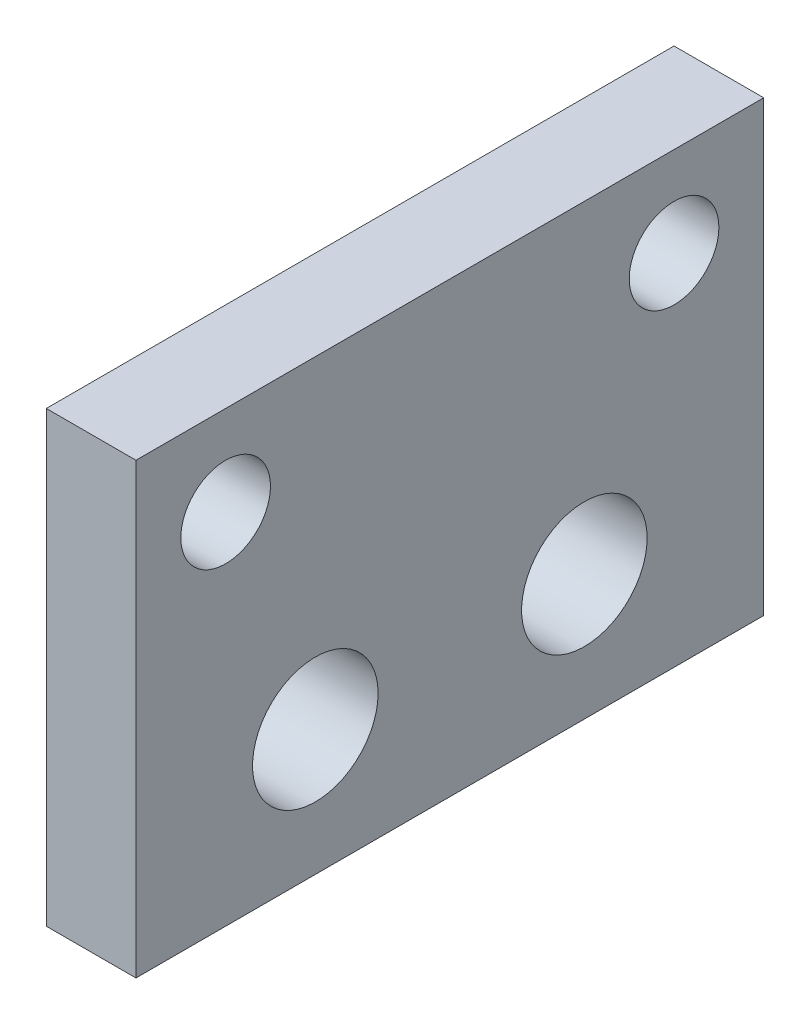
ISO-10303-21;
HEADER;
FILE_DESCRIPTION(('STEP AP214'),'2;1');
FILE_NAME('part.step','',(''),(''),'','','');
FILE_SCHEMA(('AUTOMOTIVE_DESIGN { 1 0 10303 214 1 1 1 1 }'));
ENDSEC;
DATA;
#1=APPLICATION_CONTEXT('core data for automotive mechanical design processes');
#2=APPLICATION_PROTOCOL_DEFINITION('international standard','automotive_design',2000,#1);
#3=PRODUCT_CONTEXT('',#1,'mechanical');
#4=PRODUCT('Part','Part','',(#3));
#5=PRODUCT_RELATED_PRODUCT_CATEGORY('part','',(#4));
#6=PRODUCT_DEFINITION_FORMATION('','',#4);
#7=PRODUCT_DEFINITION_CONTEXT('part definition',#1,'design');
#8=PRODUCT_DEFINITION('design','',#6,#7);
#9=PRODUCT_DEFINITION_SHAPE('','',#8);
#10=(LENGTH_UNIT() NAMED_UNIT(*) SI_UNIT(.MILLI.,.METRE.));
#11=(NAMED_UNIT(*) PLANE_ANGLE_UNIT() SI_UNIT($,.RADIAN.));
#12=(NAMED_UNIT(*) SI_UNIT($,.STERADIAN.) SOLID_ANGLE_UNIT());
#13=UNCERTAINTY_MEASURE_WITH_UNIT(LENGTH_MEASURE(1.E-05),#10,'distance_accuracy_value','');
#14=(GEOMETRIC_REPRESENTATION_CONTEXT(3) GLOBAL_UNCERTAINTY_ASSIGNED_CONTEXT((#13)) GLOBAL_UNIT_ASSIGNED_CONTEXT((#10,
#11,#12)) REPRESENTATION_CONTEXT('',''));
#15=CARTESIAN_POINT('',(0.,0.,0.));
#16=DIRECTION('',(0.,0.,1.));
#17=DIRECTION('',(1.,0.,0.));
#18=AXIS2_PLACEMENT_3D('',#15,#16,#17);
#19=CARTESIAN_POINT('',(5.,12.5,-17.5));
#20=DIRECTION('',(0.,0.,1.));
#21=DIRECTION('',(0.,-1.,0.));
#22=AXIS2_PLACEMENT_3D('',#19,#20,#21);
#23=PLANE('',#22);
#24=DIRECTION('',(0.,1.,0.));
#25=VECTOR('',#24,1.);
#26=CARTESIAN_POINT('',(0.,12.5,-17.5));
#27=LINE('',#26,#25);
#28=CARTESIAN_POINT('',(0.,-12.5,-17.5));
#29=VERTEX_POINT('',#28);
#30=CARTESIAN_POINT('',(0.,12.5,-17.5));
#31=VERTEX_POINT('',#30);
#32=EDGE_CURVE('E106',#29,#31,#27,.T.);
#33=ORIENTED_EDGE('',*,*,#32,.T.);
#34=DIRECTION('',(-1.,0.,0.));
#35=VECTOR('',#34,1.);
#36=CARTESIAN_POINT('',(5.,12.5,-17.5));
#37=LINE('',#36,#35);
#38=CARTESIAN_POINT('',(5.,12.5,-17.5));
#39=VERTEX_POINT('',#38);
#40=EDGE_CURVE('E11',#39,#31,#37,.T.);
#41=ORIENTED_EDGE('',*,*,#40,.F.);
#42=DIRECTION('',(0.,1.,0.));
#43=VECTOR('',#42,1.);
#44=CARTESIAN_POINT('',(5.,12.5,-17.5));
#45=LINE('',#44,#43);
#46=CARTESIAN_POINT('',(5.,-12.5,-17.5));
#47=VERTEX_POINT('',#46);
#48=EDGE_CURVE('E90',#47,#39,#45,.T.);
#49=ORIENTED_EDGE('',*,*,#48,.F.);
#50=DIRECTION('',(-1.,0.,0.));
#51=VECTOR('',#50,1.);
#52=CARTESIAN_POINT('',(5.,-12.5,-17.5));
#53=LINE('',#52,#51);
#54=EDGE_CURVE('E102',#47,#29,#53,.T.);
#55=ORIENTED_EDGE('',*,*,#54,.T.);
#56=EDGE_LOOP('',(#33,#41,#49,#55));
#57=FACE_BOUND('',#56,.T.);
#58=ADVANCED_FACE('F38',(#57),#23,.F.);
#59=CARTESIAN_POINT('',(5.,12.5,17.5));
#60=DIRECTION('',(0.,-1.,0.));
#61=DIRECTION('',(0.,0.,-1.));
#62=AXIS2_PLACEMENT_3D('',#59,#60,#61);
#63=PLANE('',#62);
#64=DIRECTION('',(0.,0.,1.));
#65=VECTOR('',#64,1.);
#66=CARTESIAN_POINT('',(0.,12.5,17.5));
#67=LINE('',#66,#65);
#68=CARTESIAN_POINT('',(0.,12.5,17.5));
#69=VERTEX_POINT('',#68);
#70=EDGE_CURVE('E95',#31,#69,#67,.T.);
#71=ORIENTED_EDGE('',*,*,#70,.T.);
#72=DIRECTION('',(-1.,0.,0.));
#73=VECTOR('',#72,1.);
#74=CARTESIAN_POINT('',(5.,12.5,17.5));
#75=LINE('',#74,#73);
#76=CARTESIAN_POINT('',(5.,12.5,17.5));
#77=VERTEX_POINT('',#76);
#78=EDGE_CURVE('E47',#77,#69,#75,.T.);
#79=ORIENTED_EDGE('',*,*,#78,.F.);
#80=DIRECTION('',(0.,0.,1.));
#81=VECTOR('',#80,1.);
#82=CARTESIAN_POINT('',(5.,12.5,17.5));
#83=LINE('',#82,#81);
#84=EDGE_CURVE('E85',#39,#77,#83,.T.);
#85=ORIENTED_EDGE('',*,*,#84,.F.);
#86=ORIENTED_EDGE('',*,*,#40,.T.);
#87=EDGE_LOOP('',(#71,#79,#85,#86));
#88=FACE_BOUND('',#87,.T.);
#89=ADVANCED_FACE('F94',(#88),#63,.F.);
#90=CARTESIAN_POINT('',(5.,12.5,17.5));
#91=DIRECTION('',(0.,0.,-1.));
#92=DIRECTION('',(0.,1.,0.));
#93=AXIS2_PLACEMENT_3D('',#90,#91,#92);
#94=PLANE('',#93);
#95=DIRECTION('',(0.,-1.,0.));
#96=VECTOR('',#95,1.);
#97=CARTESIAN_POINT('',(0.,12.5,17.5));
#98=LINE('',#97,#96);
#99=CARTESIAN_POINT('',(0.,-12.5,17.5));
#100=VERTEX_POINT('',#99);
#101=EDGE_CURVE('E72',#69,#100,#98,.T.);
#102=ORIENTED_EDGE('',*,*,#101,.T.);
#103=DIRECTION('',(-1.,0.,0.));
#104=VECTOR('',#103,1.);
#105=CARTESIAN_POINT('',(5.,-12.5,17.5));
#106=LINE('',#105,#104);
#107=CARTESIAN_POINT('',(5.,-12.5,17.5));
#108=VERTEX_POINT('',#107);
#109=EDGE_CURVE('E97',#108,#100,#106,.T.);
#110=ORIENTED_EDGE('',*,*,#109,.F.);
#111=DIRECTION('',(0.,-1.,0.));
#112=VECTOR('',#111,1.);
#113=CARTESIAN_POINT('',(5.,12.5,17.5));
#114=LINE('',#113,#112);
#115=EDGE_CURVE('E88',#77,#108,#114,.T.);
#116=ORIENTED_EDGE('',*,*,#115,.F.);
#117=ORIENTED_EDGE('',*,*,#78,.T.);
#118=EDGE_LOOP('',(#102,#110,#116,#117));
#119=FACE_BOUND('',#118,.T.);
#120=ADVANCED_FACE('F98',(#119),#94,.F.);
#121=CARTESIAN_POINT('',(5.,-12.5,17.5));
#122=DIRECTION('',(0.,1.,0.));
#123=DIRECTION('',(0.,0.,1.));
#124=AXIS2_PLACEMENT_3D('',#121,#122,#123);
#125=PLANE('',#124);
#126=DIRECTION('',(0.,0.,-1.));
#127=VECTOR('',#126,1.);
#128=CARTESIAN_POINT('',(0.,-12.5,17.5));
#129=LINE('',#128,#127);
#130=EDGE_CURVE('E78',#100,#29,#129,.T.);
#131=ORIENTED_EDGE('',*,*,#130,.T.);
#132=ORIENTED_EDGE('',*,*,#54,.F.);
#133=DIRECTION('',(0.,0.,-1.));
#134=VECTOR('',#133,1.);
#135=CARTESIAN_POINT('',(5.,-12.5,17.5));
#136=LINE('',#135,#134);
#137=EDGE_CURVE('E55',#108,#47,#136,.T.);
#138=ORIENTED_EDGE('',*,*,#137,.F.);
#139=ORIENTED_EDGE('',*,*,#109,.T.);
#140=EDGE_LOOP('',(#131,#132,#138,#139));
#141=FACE_BOUND('',#140,.T.);
#142=ADVANCED_FACE('F120',(#141),#125,.F.);
#143=CARTESIAN_POINT('',(5.,0.,0.));
#144=DIRECTION('',(1.,0.,0.));
#145=DIRECTION('',(0.,0.,-1.));
#146=AXIS2_PLACEMENT_3D('',#143,#144,#145);
#147=PLANE('',#146);
#148=CARTESIAN_POINT('',(5.,-5.5,7.5));
#149=DIRECTION('',(1.,0.,0.));
#150=DIRECTION('',(0.,0.,-1.));
#151=AXIS2_PLACEMENT_3D('',#148,#149,#150);
#152=CIRCLE('',#151,3.5);
#153=CARTESIAN_POINT('',(5.,-5.5,4.));
#154=VERTEX_POINT('',#153);
#155=EDGE_CURVE('E151',#154,#154,#152,.T.);
#156=ORIENTED_EDGE('',*,*,#155,.F.);
#157=EDGE_LOOP('',(#156));
#158=FACE_BOUND('',#157,.T.);
#159=CARTESIAN_POINT('',(5.,-5.5,-7.50000000000001));
#160=DIRECTION('',(1.,0.,0.));
#161=DIRECTION('',(0.,0.,-1.));
#162=AXIS2_PLACEMENT_3D('',#159,#160,#161);
#163=CIRCLE('',#162,3.5);
#164=CARTESIAN_POINT('',(5.,-5.5,-11.));
#165=VERTEX_POINT('',#164);
#166=EDGE_CURVE('E143',#165,#165,#163,.T.);
#167=ORIENTED_EDGE('',*,*,#166,.F.);
#168=EDGE_LOOP('',(#167));
#169=FACE_BOUND('',#168,.T.);
#170=CARTESIAN_POINT('',(5.,7.5,12.5));
#171=DIRECTION('',(1.,0.,0.));
#172=DIRECTION('',(0.,0.,-1.));
#173=AXIS2_PLACEMENT_3D('',#170,#171,#172);
#174=CIRCLE('',#173,2.5);
#175=CARTESIAN_POINT('',(5.,7.5,10.));
#176=VERTEX_POINT('',#175);
#177=EDGE_CURVE('E136',#176,#176,#174,.T.);
#178=ORIENTED_EDGE('',*,*,#177,.F.);
#179=EDGE_LOOP('',(#178));
#180=FACE_BOUND('',#179,.T.);
#181=CARTESIAN_POINT('',(5.,7.5,-12.5));
#182=DIRECTION('',(1.,0.,0.));
#183=DIRECTION('',(0.,0.,-1.));
#184=AXIS2_PLACEMENT_3D('',#181,#182,#183);
#185=CIRCLE('',#184,2.5);
#186=CARTESIAN_POINT('',(5.,7.5,-15.));
#187=VERTEX_POINT('',#186);
#188=EDGE_CURVE('E127',#187,#187,#185,.T.);
#189=ORIENTED_EDGE('',*,*,#188,.F.);
#190=EDGE_LOOP('',(#189));
#191=FACE_BOUND('',#190,.T.);
#192=ORIENTED_EDGE('',*,*,#48,.T.);
#193=ORIENTED_EDGE('',*,*,#84,.T.);
#194=ORIENTED_EDGE('',*,*,#115,.T.);
#195=ORIENTED_EDGE('',*,*,#137,.T.);
#196=EDGE_LOOP('',(#192,#193,#194,#195));
#197=FACE_BOUND('',#196,.T.);
#198=ADVANCED_FACE('F86',(#158,#169,#180,#191,#197),#147,.T.);
#199=CARTESIAN_POINT('',(0.,0.,0.));
#200=DIRECTION('',(1.,0.,0.));
#201=DIRECTION('',(0.,0.,-1.));
#202=AXIS2_PLACEMENT_3D('',#199,#200,#201);
#203=PLANE('',#202);
#204=CARTESIAN_POINT('',(0.,-5.5,7.5));
#205=DIRECTION('',(1.,0.,0.));
#206=DIRECTION('',(0.,0.,-1.));
#207=AXIS2_PLACEMENT_3D('',#204,#205,#206);
#208=CIRCLE('',#207,3.5);
#209=CARTESIAN_POINT('',(0.,-5.5,4.));
#210=VERTEX_POINT('',#209);
#211=EDGE_CURVE('E132',#210,#210,#208,.T.);
#212=ORIENTED_EDGE('',*,*,#211,.T.);
#213=EDGE_LOOP('',(#212));
#214=FACE_BOUND('',#213,.T.);
#215=CARTESIAN_POINT('',(0.,-5.5,-7.50000000000001));
#216=DIRECTION('',(1.,0.,0.));
#217=DIRECTION('',(0.,0.,-1.));
#218=AXIS2_PLACEMENT_3D('',#215,#216,#217);
#219=CIRCLE('',#218,3.5);
#220=CARTESIAN_POINT('',(0.,-5.5,-11.));
#221=VERTEX_POINT('',#220);
#222=EDGE_CURVE('E147',#221,#221,#219,.T.);
#223=ORIENTED_EDGE('',*,*,#222,.T.);
#224=EDGE_LOOP('',(#223));
#225=FACE_BOUND('',#224,.T.);
#226=CARTESIAN_POINT('',(0.,7.5,12.5));
#227=DIRECTION('',(1.,0.,0.));
#228=DIRECTION('',(0.,0.,-1.));
#229=AXIS2_PLACEMENT_3D('',#226,#227,#228);
#230=CIRCLE('',#229,2.5);
#231=CARTESIAN_POINT('',(0.,7.5,10.));
#232=VERTEX_POINT('',#231);
#233=EDGE_CURVE('E110',#232,#232,#230,.T.);
#234=ORIENTED_EDGE('',*,*,#233,.T.);
#235=EDGE_LOOP('',(#234));
#236=FACE_BOUND('',#235,.T.);
#237=CARTESIAN_POINT('',(0.,7.5,-12.5));
#238=DIRECTION('',(1.,0.,0.));
#239=DIRECTION('',(0.,0.,-1.));
#240=AXIS2_PLACEMENT_3D('',#237,#238,#239);
#241=CIRCLE('',#240,2.5);
#242=CARTESIAN_POINT('',(0.,7.5,-15.));
#243=VERTEX_POINT('',#242);
#244=EDGE_CURVE('E131',#243,#243,#241,.T.);
#245=ORIENTED_EDGE('',*,*,#244,.T.);
#246=EDGE_LOOP('',(#245));
#247=FACE_BOUND('',#246,.T.);
#248=ORIENTED_EDGE('',*,*,#32,.F.);
#249=ORIENTED_EDGE('',*,*,#130,.F.);
#250=ORIENTED_EDGE('',*,*,#101,.F.);
#251=ORIENTED_EDGE('',*,*,#70,.F.);
#252=EDGE_LOOP('',(#248,#249,#250,#251));
#253=FACE_BOUND('',#252,.T.);
#254=ADVANCED_FACE('F123',(#214,#225,#236,#247,#253),#203,.F.);
#255=CARTESIAN_POINT('',(0.,7.5,-12.5));
#256=DIRECTION('',(1.,0.,0.));
#257=DIRECTION('',(0.,0.,-1.));
#258=AXIS2_PLACEMENT_3D('',#255,#256,#257);
#259=CYLINDRICAL_SURFACE('',#258,2.5);
#260=ORIENTED_EDGE('',*,*,#244,.F.);
#261=EDGE_LOOP('',(#260));
#262=FACE_BOUND('',#261,.T.);
#263=ORIENTED_EDGE('',*,*,#188,.T.);
#264=EDGE_LOOP('',(#263));
#265=FACE_BOUND('',#264,.T.);
#266=ADVANCED_FACE('F177',(#262,#265),#259,.F.);
#267=CARTESIAN_POINT('',(0.,7.5,12.5));
#268=DIRECTION('',(1.,0.,0.));
#269=DIRECTION('',(0.,0.,-1.));
#270=AXIS2_PLACEMENT_3D('',#267,#268,#269);
#271=CYLINDRICAL_SURFACE('',#270,2.5);
#272=ORIENTED_EDGE('',*,*,#233,.F.);
#273=EDGE_LOOP('',(#272));
#274=FACE_BOUND('',#273,.T.);
#275=ORIENTED_EDGE('',*,*,#177,.T.);
#276=EDGE_LOOP('',(#275));
#277=FACE_BOUND('',#276,.T.);
#278=ADVANCED_FACE('F179',(#274,#277),#271,.F.);
#279=CARTESIAN_POINT('',(0.,-5.5,-7.50000000000001));
#280=DIRECTION('',(1.,0.,0.));
#281=DIRECTION('',(0.,0.,-1.));
#282=AXIS2_PLACEMENT_3D('',#279,#280,#281);
#283=CYLINDRICAL_SURFACE('',#282,3.5);
#284=ORIENTED_EDGE('',*,*,#222,.F.);
#285=EDGE_LOOP('',(#284));
#286=FACE_BOUND('',#285,.T.);
#287=ORIENTED_EDGE('',*,*,#166,.T.);
#288=EDGE_LOOP('',(#287));
#289=FACE_BOUND('',#288,.T.);
#290=ADVANCED_FACE('F164',(#286,#289),#283,.F.);
#291=CARTESIAN_POINT('',(0.,-5.5,7.5));
#292=DIRECTION('',(1.,0.,0.));
#293=DIRECTION('',(0.,0.,-1.));
#294=AXIS2_PLACEMENT_3D('',#291,#292,#293);
#295=CYLINDRICAL_SURFACE('',#294,3.5);
#296=ORIENTED_EDGE('',*,*,#211,.F.);
#297=EDGE_LOOP('',(#296));
#298=FACE_BOUND('',#297,.T.);
#299=ORIENTED_EDGE('',*,*,#155,.T.);
#300=EDGE_LOOP('',(#299));
#301=FACE_BOUND('',#300,.T.);
#302=ADVANCED_FACE('F161',(#298,#301),#295,.F.);
#303=CLOSED_SHELL('',(#58,#89,#120,#142,#198,#254,#266,#278,#290,#302));
#304=MANIFOLD_SOLID_BREP('B2',#303);
#305=ADVANCED_BREP_SHAPE_REPRESENTATION('',(#18,#304),#14);
#306=SHAPE_DEFINITION_REPRESENTATION(#9,#305);
ENDSEC;
END-ISO-10303-21;
